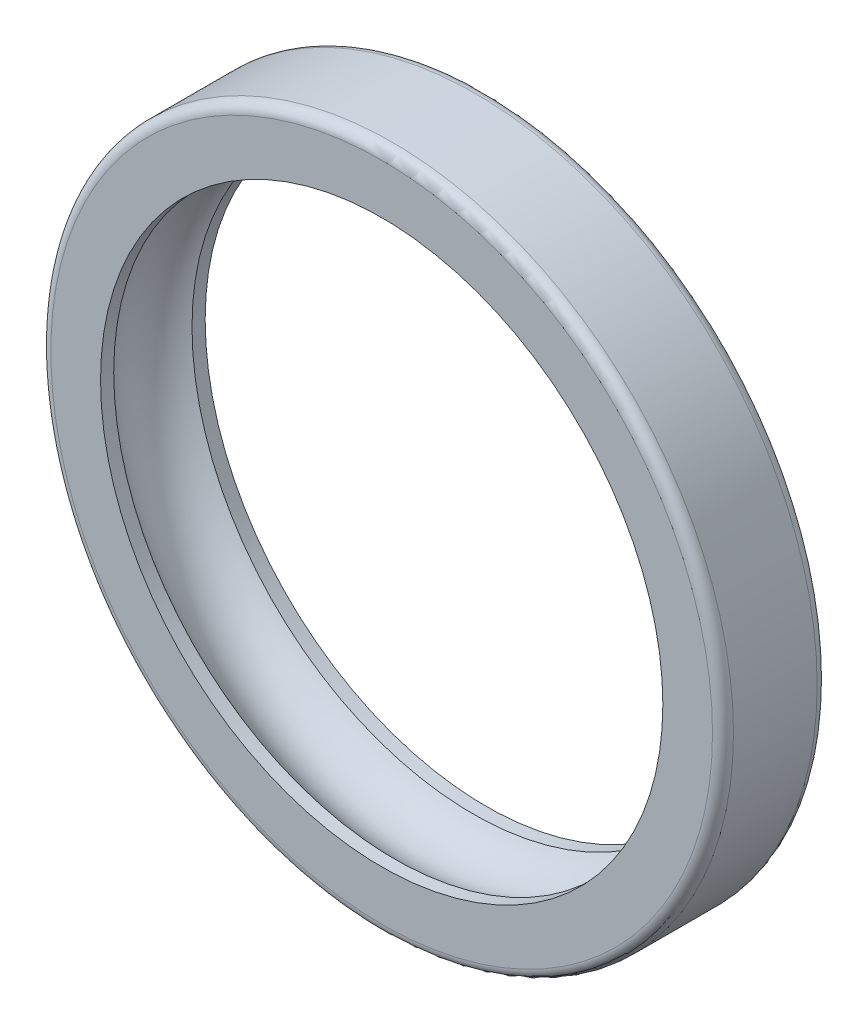
ISO-10303-21;
HEADER;
FILE_DESCRIPTION(('STEP AP214'),'2;1');
FILE_NAME('part.step','',(''),(''),'','','');
FILE_SCHEMA(('AUTOMOTIVE_DESIGN { 1 0 10303 214 1 1 1 1 }'));
ENDSEC;
DATA;
#1=APPLICATION_CONTEXT('core data for automotive mechanical design processes');
#2=APPLICATION_PROTOCOL_DEFINITION('international standard','automotive_design',2000,#1);
#3=PRODUCT_CONTEXT('',#1,'mechanical');
#4=PRODUCT('Part','Part','',(#3));
#5=PRODUCT_RELATED_PRODUCT_CATEGORY('part','',(#4));
#6=PRODUCT_DEFINITION_FORMATION('','',#4);
#7=PRODUCT_DEFINITION_CONTEXT('part definition',#1,'design');
#8=PRODUCT_DEFINITION('design','',#6,#7);
#9=PRODUCT_DEFINITION_SHAPE('','',#8);
#10=(LENGTH_UNIT() NAMED_UNIT(*) SI_UNIT(.MILLI.,.METRE.));
#11=(NAMED_UNIT(*) PLANE_ANGLE_UNIT() SI_UNIT($,.RADIAN.));
#12=(NAMED_UNIT(*) SI_UNIT($,.STERADIAN.) SOLID_ANGLE_UNIT());
#13=UNCERTAINTY_MEASURE_WITH_UNIT(LENGTH_MEASURE(1.E-05),#10,'distance_accuracy_value','');
#14=(GEOMETRIC_REPRESENTATION_CONTEXT(3) GLOBAL_UNCERTAINTY_ASSIGNED_CONTEXT((#13)) GLOBAL_UNIT_ASSIGNED_CONTEXT((#10,
#11,#12)) REPRESENTATION_CONTEXT('',''));
#15=CARTESIAN_POINT('',(0.,0.,0.));
#16=DIRECTION('',(0.,0.,1.));
#17=DIRECTION('',(1.,0.,0.));
#18=AXIS2_PLACEMENT_3D('',#15,#16,#17);
#19=CARTESIAN_POINT('',(0.,0.,10.));
#20=DIRECTION('',(0.,0.,1.));
#21=DIRECTION('',(1.,0.,0.));
#22=AXIS2_PLACEMENT_3D('',#19,#20,#21);
#23=PLANE('',#22);
#24=CARTESIAN_POINT('',(0.,0.,10.));
#25=DIRECTION('',(0.,0.,1.));
#26=DIRECTION('',(1.,0.,0.));
#27=AXIS2_PLACEMENT_3D('',#24,#25,#26);
#28=CIRCLE('',#27,63.25);
#29=CARTESIAN_POINT('',(63.25,0.,10.));
#30=VERTEX_POINT('',#29);
#31=EDGE_CURVE('E10',#30,#30,#28,.T.);
#32=ORIENTED_EDGE('',*,*,#31,.T.);
#33=EDGE_LOOP('',(#32));
#34=FACE_BOUND('',#33,.T.);
#35=CARTESIAN_POINT('',(0.,0.,10.));
#36=DIRECTION('',(0.,0.,-1.));
#37=DIRECTION('',(-1.,0.,0.));
#38=AXIS2_PLACEMENT_3D('',#35,#36,#37);
#39=CIRCLE('',#38,53.75);
#40=CARTESIAN_POINT('',(-53.75,0.,10.));
#41=VERTEX_POINT('',#40);
#42=EDGE_CURVE('E53',#41,#41,#39,.T.);
#43=ORIENTED_EDGE('',*,*,#42,.T.);
#44=EDGE_LOOP('',(#43));
#45=FACE_BOUND('',#44,.T.);
#46=ADVANCED_FACE('F33',(#34,#45),#23,.T.);
#47=CARTESIAN_POINT('',(0.,0.,-10.));
#48=DIRECTION('',(0.,0.,1.));
#49=DIRECTION('',(1.,0.,0.));
#50=AXIS2_PLACEMENT_3D('',#47,#48,#49);
#51=PLANE('',#50);
#52=CARTESIAN_POINT('',(0.,0.,-10.));
#53=DIRECTION('',(0.,0.,1.));
#54=DIRECTION('',(1.,0.,0.));
#55=AXIS2_PLACEMENT_3D('',#52,#53,#54);
#56=CIRCLE('',#55,63.25);
#57=CARTESIAN_POINT('',(63.25,0.,-10.));
#58=VERTEX_POINT('',#57);
#59=EDGE_CURVE('E40',#58,#58,#56,.F.);
#60=ORIENTED_EDGE('',*,*,#59,.T.);
#61=EDGE_LOOP('',(#60));
#62=FACE_BOUND('',#61,.T.);
#63=CARTESIAN_POINT('',(0.,0.,-10.));
#64=DIRECTION('',(0.,0.,-1.));
#65=DIRECTION('',(-1.,0.,0.));
#66=AXIS2_PLACEMENT_3D('',#63,#64,#65);
#67=CIRCLE('',#66,53.75);
#68=CARTESIAN_POINT('',(-53.75,0.,-10.));
#69=VERTEX_POINT('',#68);
#70=EDGE_CURVE('E62',#69,#69,#67,.T.);
#71=ORIENTED_EDGE('',*,*,#70,.F.);
#72=EDGE_LOOP('',(#71));
#73=FACE_BOUND('',#72,.T.);
#74=ADVANCED_FACE('F69',(#62,#73),#51,.F.);
#75=CARTESIAN_POINT('',(0.,0.,10.));
#76=DIRECTION('',(0.,0.,-1.));
#77=DIRECTION('',(-1.,0.,0.));
#78=AXIS2_PLACEMENT_3D('',#75,#76,#77);
#79=CYLINDRICAL_SURFACE('',#78,65.25);
#80=CARTESIAN_POINT('',(0.,0.,-8.));
#81=DIRECTION('',(0.,0.,1.));
#82=DIRECTION('',(1.,0.,0.));
#83=AXIS2_PLACEMENT_3D('',#80,#81,#82);
#84=CIRCLE('',#83,65.25);
#85=CARTESIAN_POINT('',(65.25,0.,-8.));
#86=VERTEX_POINT('',#85);
#87=EDGE_CURVE('E44',#86,#86,#84,.T.);
#88=ORIENTED_EDGE('',*,*,#87,.T.);
#89=EDGE_LOOP('',(#88));
#90=FACE_BOUND('',#89,.T.);
#91=CARTESIAN_POINT('',(0.,0.,8.));
#92=DIRECTION('',(0.,0.,1.));
#93=DIRECTION('',(1.,0.,0.));
#94=AXIS2_PLACEMENT_3D('',#91,#92,#93);
#95=CIRCLE('',#94,65.25);
#96=CARTESIAN_POINT('',(65.25,0.,8.));
#97=VERTEX_POINT('',#96);
#98=EDGE_CURVE('E48',#97,#97,#95,.F.);
#99=ORIENTED_EDGE('',*,*,#98,.T.);
#100=EDGE_LOOP('',(#99));
#101=FACE_BOUND('',#100,.T.);
#102=ADVANCED_FACE('F71',(#90,#101),#79,.T.);
#103=CARTESIAN_POINT('',(0.,0.,-25.1963281011935));
#104=DIRECTION('',(0.,0.,-1.));
#105=DIRECTION('',(-1.,0.,0.));
#106=AXIS2_PLACEMENT_3D('',#103,#104,#105);
#107=CYLINDRICAL_SURFACE('',#106,53.75);
#108=CARTESIAN_POINT('',(0.,0.,7.48331477354787));
#109=DIRECTION('',(0.,0.,-1.));
#110=DIRECTION('',(-1.,0.,0.));
#111=AXIS2_PLACEMENT_3D('',#108,#109,#110);
#112=CIRCLE('',#111,53.75);
#113=CARTESIAN_POINT('',(-53.75,0.,7.48331477354787));
#114=VERTEX_POINT('',#113);
#115=EDGE_CURVE('E56',#114,#114,#112,.T.);
#116=ORIENTED_EDGE('',*,*,#115,.T.);
#117=EDGE_LOOP('',(#116));
#118=FACE_BOUND('',#117,.T.);
#119=ORIENTED_EDGE('',*,*,#42,.F.);
#120=EDGE_LOOP('',(#119));
#121=FACE_BOUND('',#120,.T.);
#122=ADVANCED_FACE('F77',(#118,#121),#107,.F.);
#123=CARTESIAN_POINT('',(0.,0.,0.));
#124=DIRECTION('',(0.,0.,-1.));
#125=DIRECTION('',(-1.,0.,0.));
#126=AXIS2_PLACEMENT_3D('',#123,#124,#125);
#127=TOROIDAL_SURFACE('',#126,48.75,9.);
#128=CARTESIAN_POINT('',(0.,0.,-7.48331477354787));
#129=DIRECTION('',(0.,0.,-1.));
#130=DIRECTION('',(-1.,0.,0.));
#131=AXIS2_PLACEMENT_3D('',#128,#129,#130);
#132=CIRCLE('',#131,53.75);
#133=CARTESIAN_POINT('',(-53.75,0.,-7.48331477354787));
#134=VERTEX_POINT('',#133);
#135=EDGE_CURVE('E59',#134,#134,#132,.T.);
#136=ORIENTED_EDGE('',*,*,#135,.T.);
#137=EDGE_LOOP('',(#136));
#138=FACE_BOUND('',#137,.T.);
#139=ORIENTED_EDGE('',*,*,#115,.F.);
#140=EDGE_LOOP('',(#139));
#141=FACE_BOUND('',#140,.T.);
#142=ADVANCED_FACE('F90',(#138,#141),#127,.F.);
#143=CARTESIAN_POINT('',(0.,0.,-25.1963281011935));
#144=DIRECTION('',(0.,0.,-1.));
#145=DIRECTION('',(-1.,0.,0.));
#146=AXIS2_PLACEMENT_3D('',#143,#144,#145);
#147=CYLINDRICAL_SURFACE('',#146,53.75);
#148=ORIENTED_EDGE('',*,*,#70,.T.);
#149=EDGE_LOOP('',(#148));
#150=FACE_BOUND('',#149,.T.);
#151=ORIENTED_EDGE('',*,*,#135,.F.);
#152=EDGE_LOOP('',(#151));
#153=FACE_BOUND('',#152,.T.);
#154=ADVANCED_FACE('F66',(#150,#153),#147,.F.);
#155=CARTESIAN_POINT('',(0.,0.,-8.));
#156=DIRECTION('',(0.,0.,1.));
#157=DIRECTION('',(1.,0.,0.));
#158=AXIS2_PLACEMENT_3D('',#155,#156,#157);
#159=TOROIDAL_SURFACE('',#158,63.25,2.);
#160=ORIENTED_EDGE('',*,*,#59,.F.);
#161=EDGE_LOOP('',(#160));
#162=FACE_BOUND('',#161,.T.);
#163=ORIENTED_EDGE('',*,*,#87,.F.);
#164=EDGE_LOOP('',(#163));
#165=FACE_BOUND('',#164,.T.);
#166=ADVANCED_FACE('F82',(#162,#165),#159,.T.);
#167=CARTESIAN_POINT('',(0.,0.,8.));
#168=DIRECTION('',(0.,0.,1.));
#169=DIRECTION('',(1.,0.,0.));
#170=AXIS2_PLACEMENT_3D('',#167,#168,#169);
#171=TOROIDAL_SURFACE('',#170,63.25,2.);
#172=ORIENTED_EDGE('',*,*,#98,.F.);
#173=EDGE_LOOP('',(#172));
#174=FACE_BOUND('',#173,.T.);
#175=ORIENTED_EDGE('',*,*,#31,.F.);
#176=EDGE_LOOP('',(#175));
#177=FACE_BOUND('',#176,.T.);
#178=ADVANCED_FACE('F35',(#174,#177),#171,.T.);
#179=CLOSED_SHELL('',(#46,#74,#102,#122,#142,#154,#166,#178));
#180=MANIFOLD_SOLID_BREP('B2',#179);
#181=ADVANCED_BREP_SHAPE_REPRESENTATION('',(#18,#180),#14);
#182=SHAPE_DEFINITION_REPRESENTATION(#9,#181);
ENDSEC;
END-ISO-10303-21;
